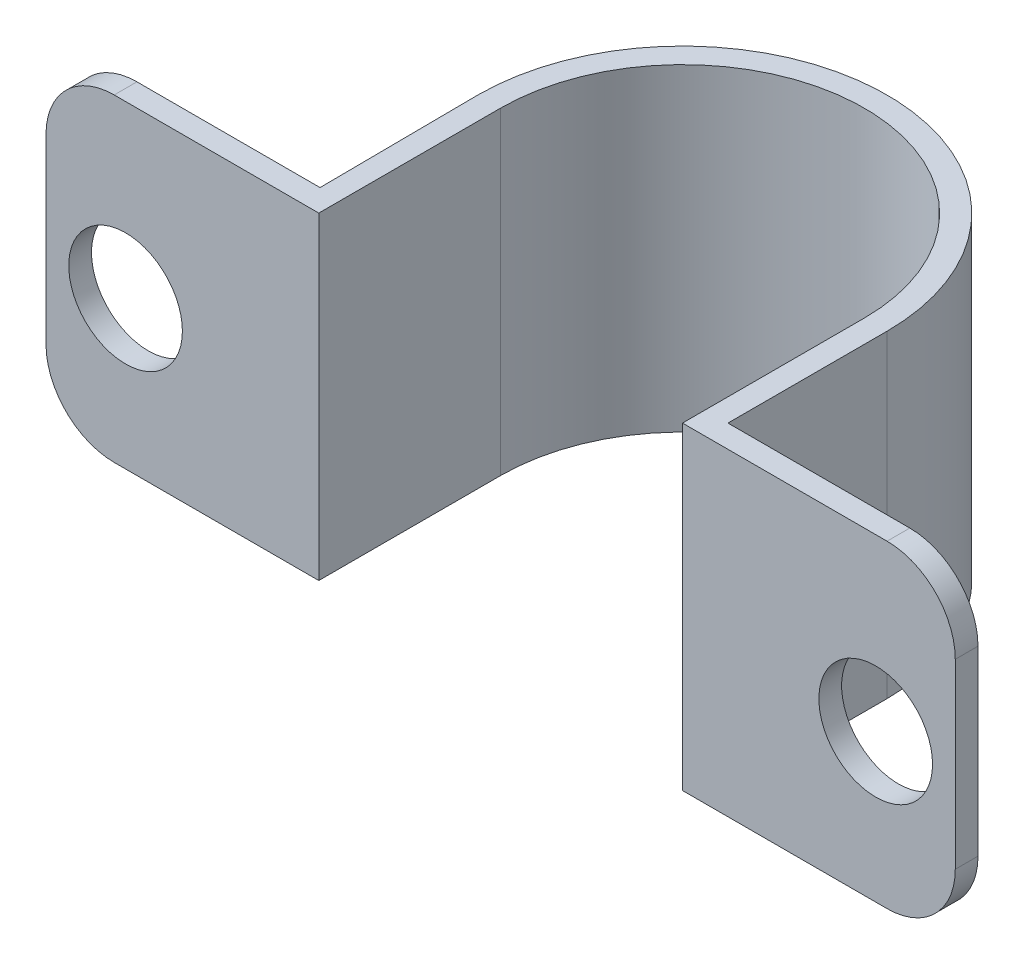
ISO-10303-21;
HEADER;
FILE_DESCRIPTION(('STEP AP214'),'2;1');
FILE_NAME('part.step','',(''),(''),'','','');
FILE_SCHEMA(('AUTOMOTIVE_DESIGN { 1 0 10303 214 1 1 1 1 }'));
ENDSEC;
DATA;
#1=APPLICATION_CONTEXT('core data for automotive mechanical design processes');
#2=APPLICATION_PROTOCOL_DEFINITION('international standard','automotive_design',2000,#1);
#3=PRODUCT_CONTEXT('',#1,'mechanical');
#4=PRODUCT('Part','Part','',(#3));
#5=PRODUCT_RELATED_PRODUCT_CATEGORY('part','',(#4));
#6=PRODUCT_DEFINITION_FORMATION('','',#4);
#7=PRODUCT_DEFINITION_CONTEXT('part definition',#1,'design');
#8=PRODUCT_DEFINITION('design','',#6,#7);
#9=PRODUCT_DEFINITION_SHAPE('','',#8);
#10=(LENGTH_UNIT() NAMED_UNIT(*) SI_UNIT(.MILLI.,.METRE.));
#11=(NAMED_UNIT(*) PLANE_ANGLE_UNIT() SI_UNIT($,.RADIAN.));
#12=(NAMED_UNIT(*) SI_UNIT($,.STERADIAN.) SOLID_ANGLE_UNIT());
#13=UNCERTAINTY_MEASURE_WITH_UNIT(LENGTH_MEASURE(1.E-05),#10,'distance_accuracy_value','');
#14=(GEOMETRIC_REPRESENTATION_CONTEXT(3) GLOBAL_UNCERTAINTY_ASSIGNED_CONTEXT((#13)) GLOBAL_UNIT_ASSIGNED_CONTEXT((#10,
#11,#12)) REPRESENTATION_CONTEXT('',''));
#15=CARTESIAN_POINT('',(0.,0.,0.));
#16=DIRECTION('',(0.,0.,1.));
#17=DIRECTION('',(1.,0.,0.));
#18=AXIS2_PLACEMENT_3D('',#15,#16,#17);
#19=CARTESIAN_POINT('',(0.,14.,-8.));
#20=DIRECTION('',(0.,-1.,0.));
#21=DIRECTION('',(0.,0.,-1.));
#22=AXIS2_PLACEMENT_3D('',#19,#20,#21);
#23=CYLINDRICAL_SURFACE('',#22,8.);
#24=CARTESIAN_POINT('',(0.,0.,-8.));
#25=DIRECTION('',(0.,1.,0.));
#26=DIRECTION('',(0.,0.,1.));
#27=AXIS2_PLACEMENT_3D('',#24,#25,#26);
#28=CIRCLE('',#27,8.);
#29=CARTESIAN_POINT('',(8.,0.,-8.));
#30=VERTEX_POINT('',#29);
#31=CARTESIAN_POINT('',(-8.,0.,-8.));
#32=VERTEX_POINT('',#31);
#33=EDGE_CURVE('E155',#30,#32,#28,.T.);
#34=ORIENTED_EDGE('',*,*,#33,.F.);
#35=DIRECTION('',(0.,-1.,0.));
#36=VECTOR('',#35,1.);
#37=CARTESIAN_POINT('',(8.,14.,-8.));
#38=LINE('',#37,#36);
#39=CARTESIAN_POINT('',(8.,14.,-8.));
#40=VERTEX_POINT('',#39);
#41=EDGE_CURVE('E150',#40,#30,#38,.T.);
#42=ORIENTED_EDGE('',*,*,#41,.F.);
#43=CARTESIAN_POINT('',(0.,14.,-8.));
#44=DIRECTION('',(0.,1.,0.));
#45=DIRECTION('',(0.,0.,1.));
#46=AXIS2_PLACEMENT_3D('',#43,#44,#45);
#47=CIRCLE('',#46,8.);
#48=CARTESIAN_POINT('',(-8.,14.,-8.));
#49=VERTEX_POINT('',#48);
#50=EDGE_CURVE('E152',#40,#49,#47,.T.);
#51=ORIENTED_EDGE('',*,*,#50,.T.);
#52=DIRECTION('',(0.,-1.,0.));
#53=VECTOR('',#52,1.);
#54=CARTESIAN_POINT('',(-8.,14.,-8.));
#55=LINE('',#54,#53);
#56=EDGE_CURVE('E196',#49,#32,#55,.T.);
#57=ORIENTED_EDGE('',*,*,#56,.T.);
#58=EDGE_LOOP('',(#34,#42,#51,#57));
#59=FACE_BOUND('',#58,.T.);
#60=ADVANCED_FACE('F35',(#59),#23,.F.);
#61=CARTESIAN_POINT('',(8.,14.,0.));
#62=DIRECTION('',(-1.,0.,0.));
#63=DIRECTION('',(0.,0.,1.));
#64=AXIS2_PLACEMENT_3D('',#61,#62,#63);
#65=PLANE('',#64);
#66=DIRECTION('',(0.,0.,-1.));
#67=VECTOR('',#66,1.);
#68=CARTESIAN_POINT('',(8.,0.,0.));
#69=LINE('',#68,#67);
#70=CARTESIAN_POINT('',(8.,0.,0.));
#71=VERTEX_POINT('',#70);
#72=EDGE_CURVE('E198',#71,#30,#69,.T.);
#73=ORIENTED_EDGE('',*,*,#72,.F.);
#74=DIRECTION('',(0.,-1.,0.));
#75=VECTOR('',#74,1.);
#76=CARTESIAN_POINT('',(8.,14.,0.));
#77=LINE('',#76,#75);
#78=CARTESIAN_POINT('',(8.,14.,0.));
#79=VERTEX_POINT('',#78);
#80=EDGE_CURVE('E161',#79,#71,#77,.T.);
#81=ORIENTED_EDGE('',*,*,#80,.F.);
#82=DIRECTION('',(0.,0.,-1.));
#83=VECTOR('',#82,1.);
#84=CARTESIAN_POINT('',(8.,14.,0.));
#85=LINE('',#84,#83);
#86=EDGE_CURVE('E167',#79,#40,#85,.T.);
#87=ORIENTED_EDGE('',*,*,#86,.T.);
#88=ORIENTED_EDGE('',*,*,#41,.T.);
#89=EDGE_LOOP('',(#73,#81,#87,#88));
#90=FACE_BOUND('',#89,.T.);
#91=ADVANCED_FACE('F173',(#90),#65,.T.);
#92=CARTESIAN_POINT('',(0.,14.,0.));
#93=DIRECTION('',(0.,0.,-1.));
#94=DIRECTION('',(-1.,0.,0.));
#95=AXIS2_PLACEMENT_3D('',#92,#93,#94);
#96=PLANE('',#95);
#97=CARTESIAN_POINT('',(16.5,6.50000000000001,0.));
#98=DIRECTION('',(0.,0.,1.));
#99=DIRECTION('',(1.,0.,0.));
#100=AXIS2_PLACEMENT_3D('',#97,#98,#99);
#101=CIRCLE('',#100,2.5);
#102=CARTESIAN_POINT('',(19.,6.50000000000001,0.));
#103=VERTEX_POINT('',#102);
#104=EDGE_CURVE('E498',#103,#103,#101,.T.);
#105=ORIENTED_EDGE('',*,*,#104,.F.);
#106=EDGE_LOOP('',(#105));
#107=FACE_BOUND('',#106,.T.);
#108=DIRECTION('',(1.,0.,0.));
#109=VECTOR('',#108,1.);
#110=CARTESIAN_POINT('',(0.,0.,0.));
#111=LINE('',#110,#109);
#112=CARTESIAN_POINT('',(17.,0.,0.));
#113=VERTEX_POINT('',#112);
#114=EDGE_CURVE('E200',#71,#113,#111,.T.);
#115=ORIENTED_EDGE('',*,*,#114,.T.);
#116=CARTESIAN_POINT('',(17.,3.,0.));
#117=DIRECTION('',(0.,0.,-1.));
#118=DIRECTION('',(-1.,0.,0.));
#119=AXIS2_PLACEMENT_3D('',#116,#117,#118);
#120=CIRCLE('',#119,3.);
#121=CARTESIAN_POINT('',(20.,3.,0.));
#122=VERTEX_POINT('',#121);
#123=EDGE_CURVE('E261',#113,#122,#120,.F.);
#124=ORIENTED_EDGE('',*,*,#123,.T.);
#125=DIRECTION('',(0.,-1.,0.));
#126=VECTOR('',#125,1.);
#127=CARTESIAN_POINT('',(20.,14.,0.));
#128=LINE('',#127,#126);
#129=CARTESIAN_POINT('',(20.,11.,0.));
#130=VERTEX_POINT('',#129);
#131=EDGE_CURVE('E242',#130,#122,#128,.T.);
#132=ORIENTED_EDGE('',*,*,#131,.F.);
#133=CARTESIAN_POINT('',(17.,11.,0.));
#134=DIRECTION('',(0.,0.,-1.));
#135=DIRECTION('',(-1.,0.,0.));
#136=AXIS2_PLACEMENT_3D('',#133,#134,#135);
#137=CIRCLE('',#136,3.);
#138=CARTESIAN_POINT('',(17.,14.,0.));
#139=VERTEX_POINT('',#138);
#140=EDGE_CURVE('E259',#130,#139,#137,.F.);
#141=ORIENTED_EDGE('',*,*,#140,.T.);
#142=DIRECTION('',(1.,0.,0.));
#143=VECTOR('',#142,1.);
#144=CARTESIAN_POINT('',(0.,14.,0.));
#145=LINE('',#144,#143);
#146=EDGE_CURVE('E175',#79,#139,#145,.T.);
#147=ORIENTED_EDGE('',*,*,#146,.F.);
#148=ORIENTED_EDGE('',*,*,#80,.T.);
#149=EDGE_LOOP('',(#115,#124,#132,#141,#147,#148));
#150=FACE_BOUND('',#149,.T.);
#151=ADVANCED_FACE('F300',(#107,#150),#96,.F.);
#152=CARTESIAN_POINT('',(20.,14.,0.));
#153=DIRECTION('',(-1.,0.,0.));
#154=DIRECTION('',(0.,0.,1.));
#155=AXIS2_PLACEMENT_3D('',#152,#153,#154);
#156=PLANE('',#155);
#157=ORIENTED_EDGE('',*,*,#131,.T.);
#158=DIRECTION('',(0.,0.,-1.));
#159=VECTOR('',#158,1.);
#160=CARTESIAN_POINT('',(20.,3.,0.));
#161=LINE('',#160,#159);
#162=CARTESIAN_POINT('',(20.,3.,-1.));
#163=VERTEX_POINT('',#162);
#164=EDGE_CURVE('E247',#122,#163,#161,.T.);
#165=ORIENTED_EDGE('',*,*,#164,.T.);
#166=DIRECTION('',(0.,-1.,0.));
#167=VECTOR('',#166,1.);
#168=CARTESIAN_POINT('',(20.,14.,-1.));
#169=LINE('',#168,#167);
#170=CARTESIAN_POINT('',(20.,11.,-1.));
#171=VERTEX_POINT('',#170);
#172=EDGE_CURVE('E239',#171,#163,#169,.T.);
#173=ORIENTED_EDGE('',*,*,#172,.F.);
#174=DIRECTION('',(0.,0.,-1.));
#175=VECTOR('',#174,1.);
#176=CARTESIAN_POINT('',(20.,11.,0.));
#177=LINE('',#176,#175);
#178=EDGE_CURVE('E160',#171,#130,#177,.F.);
#179=ORIENTED_EDGE('',*,*,#178,.T.);
#180=EDGE_LOOP('',(#157,#165,#173,#179));
#181=FACE_BOUND('',#180,.T.);
#182=ADVANCED_FACE('F307',(#181),#156,.F.);
#183=CARTESIAN_POINT('',(0.,14.,-0.999999999999998));
#184=DIRECTION('',(0.,0.,1.));
#185=DIRECTION('',(1.,0.,0.));
#186=AXIS2_PLACEMENT_3D('',#183,#184,#185);
#187=PLANE('',#186);
#188=CARTESIAN_POINT('',(16.5,6.50000000000001,-0.999999999999999));
#189=DIRECTION('',(0.,0.,1.));
#190=DIRECTION('',(1.,0.,0.));
#191=AXIS2_PLACEMENT_3D('',#188,#189,#190);
#192=CIRCLE('',#191,2.5);
#193=CARTESIAN_POINT('',(19.,6.50000000000001,-0.999999999999999));
#194=VERTEX_POINT('',#193);
#195=EDGE_CURVE('E39',#194,#194,#192,.T.);
#196=ORIENTED_EDGE('',*,*,#195,.T.);
#197=EDGE_LOOP('',(#196));
#198=FACE_BOUND('',#197,.T.);
#199=ORIENTED_EDGE('',*,*,#172,.T.);
#200=CARTESIAN_POINT('',(17.,3.,-1.));
#201=DIRECTION('',(0.,0.,1.));
#202=DIRECTION('',(1.,0.,0.));
#203=AXIS2_PLACEMENT_3D('',#200,#201,#202);
#204=CIRCLE('',#203,3.);
#205=CARTESIAN_POINT('',(17.,0.,-1.));
#206=VERTEX_POINT('',#205);
#207=EDGE_CURVE('E252',#163,#206,#204,.F.);
#208=ORIENTED_EDGE('',*,*,#207,.T.);
#209=DIRECTION('',(-1.,0.,0.));
#210=VECTOR('',#209,1.);
#211=CARTESIAN_POINT('',(0.,0.,-0.999999999999998));
#212=LINE('',#211,#210);
#213=CARTESIAN_POINT('',(9.,0.,-0.999999999999999));
#214=VERTEX_POINT('',#213);
#215=EDGE_CURVE('E203',#206,#214,#212,.T.);
#216=ORIENTED_EDGE('',*,*,#215,.T.);
#217=DIRECTION('',(0.,-1.,0.));
#218=VECTOR('',#217,1.);
#219=CARTESIAN_POINT('',(9.,14.,-0.999999999999999));
#220=LINE('',#219,#218);
#221=CARTESIAN_POINT('',(9.,14.,-0.999999999999999));
#222=VERTEX_POINT('',#221);
#223=EDGE_CURVE('E236',#222,#214,#220,.T.);
#224=ORIENTED_EDGE('',*,*,#223,.F.);
#225=DIRECTION('',(-1.,0.,0.));
#226=VECTOR('',#225,1.);
#227=CARTESIAN_POINT('',(0.,14.,-0.999999999999998));
#228=LINE('',#227,#226);
#229=CARTESIAN_POINT('',(17.,14.,-1.));
#230=VERTEX_POINT('',#229);
#231=EDGE_CURVE('E177',#230,#222,#228,.T.);
#232=ORIENTED_EDGE('',*,*,#231,.F.);
#233=CARTESIAN_POINT('',(17.,11.,-1.));
#234=DIRECTION('',(0.,0.,1.));
#235=DIRECTION('',(1.,0.,0.));
#236=AXIS2_PLACEMENT_3D('',#233,#234,#235);
#237=CIRCLE('',#236,3.);
#238=EDGE_CURVE('E250',#230,#171,#237,.F.);
#239=ORIENTED_EDGE('',*,*,#238,.T.);
#240=EDGE_LOOP('',(#199,#208,#216,#224,#232,#239));
#241=FACE_BOUND('',#240,.T.);
#242=ADVANCED_FACE('F310',(#198,#241),#187,.F.);
#243=CARTESIAN_POINT('',(9.,14.,0.));
#244=DIRECTION('',(1.,0.,0.));
#245=DIRECTION('',(0.,0.,-1.));
#246=AXIS2_PLACEMENT_3D('',#243,#244,#245);
#247=PLANE('',#246);
#248=DIRECTION('',(0.,0.,1.));
#249=VECTOR('',#248,1.);
#250=CARTESIAN_POINT('',(9.,0.,0.));
#251=LINE('',#250,#249);
#252=CARTESIAN_POINT('',(9.,0.,-8.));
#253=VERTEX_POINT('',#252);
#254=EDGE_CURVE('E205',#253,#214,#251,.T.);
#255=ORIENTED_EDGE('',*,*,#254,.F.);
#256=DIRECTION('',(0.,-1.,0.));
#257=VECTOR('',#256,1.);
#258=CARTESIAN_POINT('',(9.,14.,-8.));
#259=LINE('',#258,#257);
#260=CARTESIAN_POINT('',(9.,14.,-8.));
#261=VERTEX_POINT('',#260);
#262=EDGE_CURVE('E234',#261,#253,#259,.T.);
#263=ORIENTED_EDGE('',*,*,#262,.F.);
#264=DIRECTION('',(0.,0.,1.));
#265=VECTOR('',#264,1.);
#266=CARTESIAN_POINT('',(9.,14.,0.));
#267=LINE('',#266,#265);
#268=EDGE_CURVE('E182',#261,#222,#267,.T.);
#269=ORIENTED_EDGE('',*,*,#268,.T.);
#270=ORIENTED_EDGE('',*,*,#223,.T.);
#271=EDGE_LOOP('',(#255,#263,#269,#270));
#272=FACE_BOUND('',#271,.T.);
#273=ADVANCED_FACE('F320',(#272),#247,.T.);
#274=CARTESIAN_POINT('',(0.,14.,-8.));
#275=DIRECTION('',(0.,-1.,0.));
#276=DIRECTION('',(0.,0.,-1.));
#277=AXIS2_PLACEMENT_3D('',#274,#275,#276);
#278=CYLINDRICAL_SURFACE('',#277,9.);
#279=CARTESIAN_POINT('',(0.,0.,-8.));
#280=DIRECTION('',(0.,1.,0.));
#281=DIRECTION('',(0.,0.,1.));
#282=AXIS2_PLACEMENT_3D('',#279,#280,#281);
#283=CIRCLE('',#282,9.);
#284=CARTESIAN_POINT('',(-9.,0.,-8.));
#285=VERTEX_POINT('',#284);
#286=EDGE_CURVE('E208',#253,#285,#283,.T.);
#287=ORIENTED_EDGE('',*,*,#286,.T.);
#288=DIRECTION('',(0.,-1.,0.));
#289=VECTOR('',#288,1.);
#290=CARTESIAN_POINT('',(-9.,14.,-8.));
#291=LINE('',#290,#289);
#292=CARTESIAN_POINT('',(-9.,14.,-8.));
#293=VERTEX_POINT('',#292);
#294=EDGE_CURVE('E231',#293,#285,#291,.T.);
#295=ORIENTED_EDGE('',*,*,#294,.F.);
#296=CARTESIAN_POINT('',(0.,14.,-8.));
#297=DIRECTION('',(0.,1.,0.));
#298=DIRECTION('',(0.,0.,1.));
#299=AXIS2_PLACEMENT_3D('',#296,#297,#298);
#300=CIRCLE('',#299,9.);
#301=EDGE_CURVE('E185',#261,#293,#300,.T.);
#302=ORIENTED_EDGE('',*,*,#301,.F.);
#303=ORIENTED_EDGE('',*,*,#262,.T.);
#304=EDGE_LOOP('',(#287,#295,#302,#303));
#305=FACE_BOUND('',#304,.T.);
#306=ADVANCED_FACE('F325',(#305),#278,.T.);
#307=CARTESIAN_POINT('',(-8.93574440680154,14.,0.0711388526466279));
#308=DIRECTION('',(0.99996831150615,0.,-0.00796090343736634));
#309=DIRECTION('',(-0.00796090343736634,0.,-0.99996831150615));
#310=AXIS2_PLACEMENT_3D('',#307,#308,#309);
#311=PLANE('',#310);
#312=DIRECTION('',(0.00796090343736634,0.,0.99996831150615));
#313=VECTOR('',#312,1.);
#314=CARTESIAN_POINT('',(-8.93574440680154,0.,0.0711388526466279));
#315=LINE('',#314,#313);
#316=CARTESIAN_POINT('',(-8.9442719099992,0.,-0.999999999999998));
#317=VERTEX_POINT('',#316);
#318=EDGE_CURVE('E210',#285,#317,#315,.T.);
#319=ORIENTED_EDGE('',*,*,#318,.T.);
#320=DIRECTION('',(0.,-1.,0.));
#321=VECTOR('',#320,1.);
#322=CARTESIAN_POINT('',(-8.9442719099992,14.,-0.999999999999998));
#323=LINE('',#322,#321);
#324=CARTESIAN_POINT('',(-8.9442719099992,14.,-0.999999999999998));
#325=VERTEX_POINT('',#324);
#326=EDGE_CURVE('E228',#325,#317,#323,.T.);
#327=ORIENTED_EDGE('',*,*,#326,.F.);
#328=DIRECTION('',(0.00796090343736634,0.,0.99996831150615));
#329=VECTOR('',#328,1.);
#330=CARTESIAN_POINT('',(-8.93574440680154,14.,0.0711388526466279));
#331=LINE('',#330,#329);
#332=EDGE_CURVE('E187',#293,#325,#331,.T.);
#333=ORIENTED_EDGE('',*,*,#332,.F.);
#334=ORIENTED_EDGE('',*,*,#294,.T.);
#335=EDGE_LOOP('',(#319,#327,#333,#334));
#336=FACE_BOUND('',#335,.T.);
#337=ADVANCED_FACE('F328',(#336),#311,.F.);
#338=CARTESIAN_POINT('',(0.,14.,-0.999999999999998));
#339=DIRECTION('',(0.,0.,-1.));
#340=DIRECTION('',(-1.,0.,0.));
#341=AXIS2_PLACEMENT_3D('',#338,#339,#340);
#342=PLANE('',#341);
#343=CARTESIAN_POINT('',(-16.5,6.5,-0.999999999999997));
#344=DIRECTION('',(0.,0.,-1.));
#345=DIRECTION('',(-1.,0.,0.));
#346=AXIS2_PLACEMENT_3D('',#343,#344,#345);
#347=CIRCLE('',#346,2.5);
#348=CARTESIAN_POINT('',(-19.,6.5,-0.999999999999997));
#349=VERTEX_POINT('',#348);
#350=EDGE_CURVE('E494',#349,#349,#347,.T.);
#351=ORIENTED_EDGE('',*,*,#350,.F.);
#352=EDGE_LOOP('',(#351));
#353=FACE_BOUND('',#352,.T.);
#354=DIRECTION('',(0.,-1.,0.));
#355=VECTOR('',#354,1.);
#356=CARTESIAN_POINT('',(-20.,14.,-0.999999999999999));
#357=LINE('',#356,#355);
#358=CARTESIAN_POINT('',(-20.,11.,-0.999999999999999));
#359=VERTEX_POINT('',#358);
#360=CARTESIAN_POINT('',(-20.,3.,-0.999999999999999));
#361=VERTEX_POINT('',#360);
#362=EDGE_CURVE('E226',#359,#361,#357,.T.);
#363=ORIENTED_EDGE('',*,*,#362,.F.);
#364=CARTESIAN_POINT('',(-17.,11.,-0.999999999999998));
#365=DIRECTION('',(0.,0.,-1.));
#366=DIRECTION('',(-1.,0.,0.));
#367=AXIS2_PLACEMENT_3D('',#364,#365,#366);
#368=CIRCLE('',#367,3.);
#369=CARTESIAN_POINT('',(-17.,14.,-0.999999999999998));
#370=VERTEX_POINT('',#369);
#371=EDGE_CURVE('E59',#359,#370,#368,.T.);
#372=ORIENTED_EDGE('',*,*,#371,.T.);
#373=DIRECTION('',(1.,0.,0.));
#374=VECTOR('',#373,1.);
#375=CARTESIAN_POINT('',(0.,14.,-0.999999999999998));
#376=LINE('',#375,#374);
#377=EDGE_CURVE('E190',#370,#325,#376,.T.);
#378=ORIENTED_EDGE('',*,*,#377,.T.);
#379=ORIENTED_EDGE('',*,*,#326,.T.);
#380=DIRECTION('',(1.,0.,0.));
#381=VECTOR('',#380,1.);
#382=CARTESIAN_POINT('',(0.,0.,-0.999999999999998));
#383=LINE('',#382,#381);
#384=CARTESIAN_POINT('',(-17.,0.,-0.999999999999998));
#385=VERTEX_POINT('',#384);
#386=EDGE_CURVE('E213',#385,#317,#383,.T.);
#387=ORIENTED_EDGE('',*,*,#386,.F.);
#388=CARTESIAN_POINT('',(-17.,3.,-0.999999999999998));
#389=DIRECTION('',(0.,0.,-1.));
#390=DIRECTION('',(-1.,0.,0.));
#391=AXIS2_PLACEMENT_3D('',#388,#389,#390);
#392=CIRCLE('',#391,3.);
#393=EDGE_CURVE('E51',#385,#361,#392,.T.);
#394=ORIENTED_EDGE('',*,*,#393,.T.);
#395=EDGE_LOOP('',(#363,#372,#378,#379,#387,#394));
#396=FACE_BOUND('',#395,.T.);
#397=ADVANCED_FACE('F288',(#353,#396),#342,.T.);
#398=CARTESIAN_POINT('',(-20.,14.,0.));
#399=DIRECTION('',(-1.,0.,0.));
#400=DIRECTION('',(0.,0.,1.));
#401=AXIS2_PLACEMENT_3D('',#398,#399,#400);
#402=PLANE('',#401);
#403=DIRECTION('',(0.,-1.,0.));
#404=VECTOR('',#403,1.);
#405=CARTESIAN_POINT('',(-20.,14.,0.));
#406=LINE('',#405,#404);
#407=CARTESIAN_POINT('',(-20.,11.,0.));
#408=VERTEX_POINT('',#407);
#409=CARTESIAN_POINT('',(-20.,3.,0.));
#410=VERTEX_POINT('',#409);
#411=EDGE_CURVE('E223',#408,#410,#406,.T.);
#412=ORIENTED_EDGE('',*,*,#411,.F.);
#413=DIRECTION('',(0.,0.,-1.));
#414=VECTOR('',#413,1.);
#415=CARTESIAN_POINT('',(-20.,11.,0.));
#416=LINE('',#415,#414);
#417=EDGE_CURVE('E270',#408,#359,#416,.T.);
#418=ORIENTED_EDGE('',*,*,#417,.T.);
#419=ORIENTED_EDGE('',*,*,#362,.T.);
#420=DIRECTION('',(0.,0.,-1.));
#421=VECTOR('',#420,1.);
#422=CARTESIAN_POINT('',(-20.,3.,0.));
#423=LINE('',#422,#421);
#424=EDGE_CURVE('E268',#361,#410,#423,.F.);
#425=ORIENTED_EDGE('',*,*,#424,.T.);
#426=EDGE_LOOP('',(#412,#418,#419,#425));
#427=FACE_BOUND('',#426,.T.);
#428=ADVANCED_FACE('F287',(#427),#402,.T.);
#429=CARTESIAN_POINT('',(0.,14.,0.));
#430=DIRECTION('',(0.,0.,1.));
#431=DIRECTION('',(1.,0.,0.));
#432=AXIS2_PLACEMENT_3D('',#429,#430,#431);
#433=PLANE('',#432);
#434=CARTESIAN_POINT('',(-16.5,6.5,0.));
#435=DIRECTION('',(0.,0.,1.));
#436=DIRECTION('',(1.,0.,0.));
#437=AXIS2_PLACEMENT_3D('',#434,#435,#436);
#438=CIRCLE('',#437,2.5);
#439=CARTESIAN_POINT('',(-14.,6.5,0.));
#440=VERTEX_POINT('',#439);
#441=EDGE_CURVE('E495',#440,#440,#438,.T.);
#442=ORIENTED_EDGE('',*,*,#441,.F.);
#443=EDGE_LOOP('',(#442));
#444=FACE_BOUND('',#443,.T.);
#445=DIRECTION('',(-1.,0.,0.));
#446=VECTOR('',#445,1.);
#447=CARTESIAN_POINT('',(0.,14.,0.));
#448=LINE('',#447,#446);
#449=CARTESIAN_POINT('',(-8.,14.,0.));
#450=VERTEX_POINT('',#449);
#451=CARTESIAN_POINT('',(-17.,14.,0.));
#452=VERTEX_POINT('',#451);
#453=EDGE_CURVE('E192',#450,#452,#448,.T.);
#454=ORIENTED_EDGE('',*,*,#453,.T.);
#455=CARTESIAN_POINT('',(-17.,11.,0.));
#456=DIRECTION('',(0.,0.,1.));
#457=DIRECTION('',(1.,0.,0.));
#458=AXIS2_PLACEMENT_3D('',#455,#456,#457);
#459=CIRCLE('',#458,3.);
#460=EDGE_CURVE('E11',#452,#408,#459,.T.);
#461=ORIENTED_EDGE('',*,*,#460,.T.);
#462=ORIENTED_EDGE('',*,*,#411,.T.);
#463=CARTESIAN_POINT('',(-17.,3.,0.));
#464=DIRECTION('',(0.,0.,1.));
#465=DIRECTION('',(1.,0.,0.));
#466=AXIS2_PLACEMENT_3D('',#463,#464,#465);
#467=CIRCLE('',#466,3.);
#468=CARTESIAN_POINT('',(-17.,0.,0.));
#469=VERTEX_POINT('',#468);
#470=EDGE_CURVE('E44',#410,#469,#467,.T.);
#471=ORIENTED_EDGE('',*,*,#470,.T.);
#472=DIRECTION('',(-1.,0.,0.));
#473=VECTOR('',#472,1.);
#474=CARTESIAN_POINT('',(0.,0.,0.));
#475=LINE('',#474,#473);
#476=CARTESIAN_POINT('',(-8.,0.,0.));
#477=VERTEX_POINT('',#476);
#478=EDGE_CURVE('E215',#477,#469,#475,.T.);
#479=ORIENTED_EDGE('',*,*,#478,.F.);
#480=DIRECTION('',(0.,-1.,0.));
#481=VECTOR('',#480,1.);
#482=CARTESIAN_POINT('',(-8.,14.,0.));
#483=LINE('',#482,#481);
#484=EDGE_CURVE('E221',#450,#477,#483,.T.);
#485=ORIENTED_EDGE('',*,*,#484,.F.);
#486=EDGE_LOOP('',(#454,#461,#462,#471,#479,#485));
#487=FACE_BOUND('',#486,.T.);
#488=ADVANCED_FACE('F277',(#444,#487),#433,.T.);
#489=CARTESIAN_POINT('',(-8.,14.,0.));
#490=DIRECTION('',(1.,0.,0.));
#491=DIRECTION('',(0.,0.,-1.));
#492=AXIS2_PLACEMENT_3D('',#489,#490,#491);
#493=PLANE('',#492);
#494=DIRECTION('',(0.,0.,1.));
#495=VECTOR('',#494,1.);
#496=CARTESIAN_POINT('',(-8.,0.,0.));
#497=LINE('',#496,#495);
#498=EDGE_CURVE('E171',#32,#477,#497,.T.);
#499=ORIENTED_EDGE('',*,*,#498,.F.);
#500=ORIENTED_EDGE('',*,*,#56,.F.);
#501=DIRECTION('',(0.,0.,1.));
#502=VECTOR('',#501,1.);
#503=CARTESIAN_POINT('',(-8.,14.,0.));
#504=LINE('',#503,#502);
#505=EDGE_CURVE('E170',#49,#450,#504,.T.);
#506=ORIENTED_EDGE('',*,*,#505,.T.);
#507=ORIENTED_EDGE('',*,*,#484,.T.);
#508=EDGE_LOOP('',(#499,#500,#506,#507));
#509=FACE_BOUND('',#508,.T.);
#510=ADVANCED_FACE('F295',(#509),#493,.T.);
#511=CARTESIAN_POINT('',(0.,14.,0.));
#512=DIRECTION('',(0.,1.,0.));
#513=DIRECTION('',(0.,0.,1.));
#514=AXIS2_PLACEMENT_3D('',#511,#512,#513);
#515=PLANE('',#514);
#516=ORIENTED_EDGE('',*,*,#146,.T.);
#517=DIRECTION('',(0.,0.,-1.));
#518=VECTOR('',#517,1.);
#519=CARTESIAN_POINT('',(17.,14.,-1.));
#520=LINE('',#519,#518);
#521=EDGE_CURVE('E265',#139,#230,#520,.T.);
#522=ORIENTED_EDGE('',*,*,#521,.T.);
#523=ORIENTED_EDGE('',*,*,#231,.T.);
#524=ORIENTED_EDGE('',*,*,#268,.F.);
#525=ORIENTED_EDGE('',*,*,#301,.T.);
#526=ORIENTED_EDGE('',*,*,#332,.T.);
#527=ORIENTED_EDGE('',*,*,#377,.F.);
#528=DIRECTION('',(0.,0.,-1.));
#529=VECTOR('',#528,1.);
#530=CARTESIAN_POINT('',(-17.,14.,0.));
#531=LINE('',#530,#529);
#532=EDGE_CURVE('E263',#370,#452,#531,.F.);
#533=ORIENTED_EDGE('',*,*,#532,.T.);
#534=ORIENTED_EDGE('',*,*,#453,.F.);
#535=ORIENTED_EDGE('',*,*,#505,.F.);
#536=ORIENTED_EDGE('',*,*,#50,.F.);
#537=ORIENTED_EDGE('',*,*,#86,.F.);
#538=EDGE_LOOP('',(#516,#522,#523,#524,#525,#526,#527,#533,#534,#535,#536,#537));
#539=FACE_BOUND('',#538,.T.);
#540=ADVANCED_FACE('F166',(#539),#515,.T.);
#541=CARTESIAN_POINT('',(0.,0.,0.));
#542=DIRECTION('',(0.,1.,0.));
#543=DIRECTION('',(0.,0.,1.));
#544=AXIS2_PLACEMENT_3D('',#541,#542,#543);
#545=PLANE('',#544);
#546=ORIENTED_EDGE('',*,*,#215,.F.);
#547=DIRECTION('',(0.,0.,-1.));
#548=VECTOR('',#547,1.);
#549=CARTESIAN_POINT('',(17.,0.,0.));
#550=LINE('',#549,#548);
#551=EDGE_CURVE('E257',#206,#113,#550,.F.);
#552=ORIENTED_EDGE('',*,*,#551,.T.);
#553=ORIENTED_EDGE('',*,*,#114,.F.);
#554=ORIENTED_EDGE('',*,*,#72,.T.);
#555=ORIENTED_EDGE('',*,*,#33,.T.);
#556=ORIENTED_EDGE('',*,*,#498,.T.);
#557=ORIENTED_EDGE('',*,*,#478,.T.);
#558=DIRECTION('',(0.,0.,-1.));
#559=VECTOR('',#558,1.);
#560=CARTESIAN_POINT('',(-17.,0.,-0.999999999999999));
#561=LINE('',#560,#559);
#562=EDGE_CURVE('E254',#469,#385,#561,.T.);
#563=ORIENTED_EDGE('',*,*,#562,.T.);
#564=ORIENTED_EDGE('',*,*,#386,.T.);
#565=ORIENTED_EDGE('',*,*,#318,.F.);
#566=ORIENTED_EDGE('',*,*,#286,.F.);
#567=ORIENTED_EDGE('',*,*,#254,.T.);
#568=EDGE_LOOP('',(#546,#552,#553,#554,#555,#556,#557,#563,#564,#565,#566,#567));
#569=FACE_BOUND('',#568,.T.);
#570=ADVANCED_FACE('F284',(#569),#545,.F.);
#571=CARTESIAN_POINT('',(17.,3.,0.));
#572=DIRECTION('',(0.,0.,-1.));
#573=DIRECTION('',(-1.,0.,0.));
#574=AXIS2_PLACEMENT_3D('',#571,#572,#573);
#575=CYLINDRICAL_SURFACE('',#574,3.);
#576=ORIENTED_EDGE('',*,*,#123,.F.);
#577=ORIENTED_EDGE('',*,*,#551,.F.);
#578=ORIENTED_EDGE('',*,*,#207,.F.);
#579=ORIENTED_EDGE('',*,*,#164,.F.);
#580=EDGE_LOOP('',(#576,#577,#578,#579));
#581=FACE_BOUND('',#580,.T.);
#582=ADVANCED_FACE('F304',(#581),#575,.T.);
#583=CARTESIAN_POINT('',(17.,11.,0.));
#584=DIRECTION('',(0.,0.,1.));
#585=DIRECTION('',(1.,0.,0.));
#586=AXIS2_PLACEMENT_3D('',#583,#584,#585);
#587=CYLINDRICAL_SURFACE('',#586,3.);
#588=ORIENTED_EDGE('',*,*,#140,.F.);
#589=ORIENTED_EDGE('',*,*,#178,.F.);
#590=ORIENTED_EDGE('',*,*,#238,.F.);
#591=ORIENTED_EDGE('',*,*,#521,.F.);
#592=EDGE_LOOP('',(#588,#589,#590,#591));
#593=FACE_BOUND('',#592,.T.);
#594=ADVANCED_FACE('F316',(#593),#587,.T.);
#595=CARTESIAN_POINT('',(-17.,11.,0.));
#596=DIRECTION('',(0.,0.,-1.));
#597=DIRECTION('',(-1.,0.,0.));
#598=AXIS2_PLACEMENT_3D('',#595,#596,#597);
#599=CYLINDRICAL_SURFACE('',#598,3.);
#600=ORIENTED_EDGE('',*,*,#460,.F.);
#601=ORIENTED_EDGE('',*,*,#532,.F.);
#602=ORIENTED_EDGE('',*,*,#371,.F.);
#603=ORIENTED_EDGE('',*,*,#417,.F.);
#604=EDGE_LOOP('',(#600,#601,#602,#603));
#605=FACE_BOUND('',#604,.T.);
#606=ADVANCED_FACE('F293',(#605),#599,.T.);
#607=CARTESIAN_POINT('',(-17.,3.,0.));
#608=DIRECTION('',(0.,0.,1.));
#609=DIRECTION('',(1.,0.,0.));
#610=AXIS2_PLACEMENT_3D('',#607,#608,#609);
#611=CYLINDRICAL_SURFACE('',#610,3.);
#612=ORIENTED_EDGE('',*,*,#470,.F.);
#613=ORIENTED_EDGE('',*,*,#424,.F.);
#614=ORIENTED_EDGE('',*,*,#393,.F.);
#615=ORIENTED_EDGE('',*,*,#562,.F.);
#616=EDGE_LOOP('',(#612,#613,#614,#615));
#617=FACE_BOUND('',#616,.T.);
#618=ADVANCED_FACE('F37',(#617),#611,.T.);
#619=CARTESIAN_POINT('',(-16.5,6.5,-10.));
#620=DIRECTION('',(0.,0.,1.));
#621=DIRECTION('',(1.,0.,0.));
#622=AXIS2_PLACEMENT_3D('',#619,#620,#621);
#623=CYLINDRICAL_SURFACE('',#622,2.5);
#624=ORIENTED_EDGE('',*,*,#350,.T.);
#625=EDGE_LOOP('',(#624));
#626=FACE_BOUND('',#625,.T.);
#627=ORIENTED_EDGE('',*,*,#441,.T.);
#628=EDGE_LOOP('',(#627));
#629=FACE_BOUND('',#628,.T.);
#630=ADVANCED_FACE('F353',(#626,#629),#623,.F.);
#631=CARTESIAN_POINT('',(16.5,6.50000000000001,-10.));
#632=DIRECTION('',(0.,0.,1.));
#633=DIRECTION('',(1.,0.,0.));
#634=AXIS2_PLACEMENT_3D('',#631,#632,#633);
#635=CYLINDRICAL_SURFACE('',#634,2.5);
#636=ORIENTED_EDGE('',*,*,#104,.T.);
#637=EDGE_LOOP('',(#636));
#638=FACE_BOUND('',#637,.T.);
#639=ORIENTED_EDGE('',*,*,#195,.F.);
#640=EDGE_LOOP('',(#639));
#641=FACE_BOUND('',#640,.T.);
#642=ADVANCED_FACE('F357',(#638,#641),#635,.F.);
#643=CLOSED_SHELL('',(#60,#91,#151,#182,#242,#273,#306,#337,#397,#428,#488,#510,#540,#570,#582,
#594,#606,#618,#630,#642));
#644=MANIFOLD_SOLID_BREP('B2',#643);
#645=ADVANCED_BREP_SHAPE_REPRESENTATION('',(#18,#644),#14);
#646=SHAPE_DEFINITION_REPRESENTATION(#9,#645);
ENDSEC;
END-ISO-10303-21;
